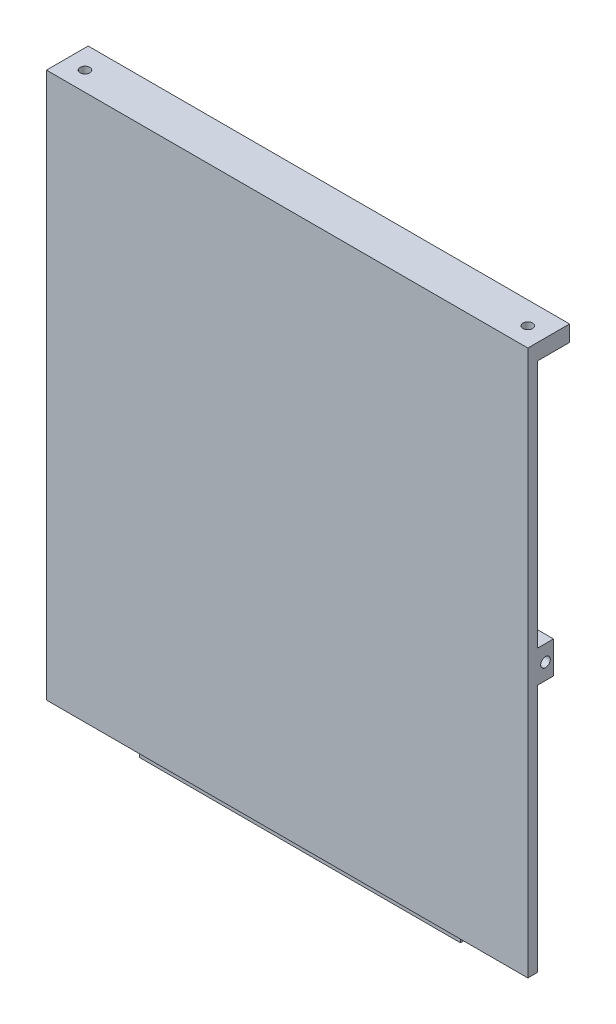
ISO-10303-21;
HEADER;
FILE_DESCRIPTION(('STEP AP214'),'2;1');
FILE_NAME('part.step','',(''),(''),'','','');
FILE_SCHEMA(('AUTOMOTIVE_DESIGN { 1 0 10303 214 1 1 1 1 }'));
ENDSEC;
DATA;
#1=APPLICATION_CONTEXT('core data for automotive mechanical design processes');
#2=APPLICATION_PROTOCOL_DEFINITION('international standard','automotive_design',2000,#1);
#3=PRODUCT_CONTEXT('',#1,'mechanical');
#4=PRODUCT('Part','Part','',(#3));
#5=PRODUCT_RELATED_PRODUCT_CATEGORY('part','',(#4));
#6=PRODUCT_DEFINITION_FORMATION('','',#4);
#7=PRODUCT_DEFINITION_CONTEXT('part definition',#1,'design');
#8=PRODUCT_DEFINITION('design','',#6,#7);
#9=PRODUCT_DEFINITION_SHAPE('','',#8);
#10=(LENGTH_UNIT() NAMED_UNIT(*) SI_UNIT(.MILLI.,.METRE.));
#11=(NAMED_UNIT(*) PLANE_ANGLE_UNIT() SI_UNIT($,.RADIAN.));
#12=(NAMED_UNIT(*) SI_UNIT($,.STERADIAN.) SOLID_ANGLE_UNIT());
#13=UNCERTAINTY_MEASURE_WITH_UNIT(LENGTH_MEASURE(1.E-05),#10,'distance_accuracy_value','');
#14=(GEOMETRIC_REPRESENTATION_CONTEXT(3) GLOBAL_UNCERTAINTY_ASSIGNED_CONTEXT((#13)) GLOBAL_UNIT_ASSIGNED_CONTEXT((#10,
#11,#12)) REPRESENTATION_CONTEXT('',''));
#15=CARTESIAN_POINT('',(0.,0.,0.));
#16=DIRECTION('',(0.,0.,1.));
#17=DIRECTION('',(1.,0.,0.));
#18=AXIS2_PLACEMENT_3D('',#15,#16,#17);
#19=CARTESIAN_POINT('',(0.,-5.,0.));
#20=DIRECTION('',(0.,-1.,0.));
#21=DIRECTION('',(0.,0.,-1.));
#22=AXIS2_PLACEMENT_3D('',#19,#20,#21);
#23=PLANE('',#22);
#24=DIRECTION('',(0.,0.,1.));
#25=VECTOR('',#24,1.);
#26=CARTESIAN_POINT('',(49.9999999999999,-5.,-4.5));
#27=LINE('',#26,#25);
#28=CARTESIAN_POINT('',(49.9999999999999,-5.,-4.5));
#29=VERTEX_POINT('',#28);
#30=CARTESIAN_POINT('',(49.9999999999999,-5.,-2.5));
#31=VERTEX_POINT('',#30);
#32=EDGE_CURVE('E306',#29,#31,#27,.T.);
#33=ORIENTED_EDGE('',*,*,#32,.T.);
#34=DIRECTION('',(1.,0.,0.));
#35=VECTOR('',#34,1.);
#36=CARTESIAN_POINT('',(-50.0000000000001,-5.,-2.5));
#37=LINE('',#36,#35);
#38=CARTESIAN_POINT('',(-50.0000000000001,-5.,-2.5));
#39=VERTEX_POINT('',#38);
#40=EDGE_CURVE('E192',#39,#31,#37,.T.);
#41=ORIENTED_EDGE('',*,*,#40,.F.);
#42=DIRECTION('',(0.,0.,-1.));
#43=VECTOR('',#42,1.);
#44=CARTESIAN_POINT('',(-50.0000000000001,-5.,-4.5));
#45=LINE('',#44,#43);
#46=CARTESIAN_POINT('',(-50.0000000000001,-5.,-4.5));
#47=VERTEX_POINT('',#46);
#48=EDGE_CURVE('E309',#39,#47,#45,.T.);
#49=ORIENTED_EDGE('',*,*,#48,.T.);
#50=DIRECTION('',(1.,0.,0.));
#51=VECTOR('',#50,1.);
#52=CARTESIAN_POINT('',(49.9999999999999,-5.,-4.5));
#53=LINE('',#52,#51);
#54=EDGE_CURVE('E313',#47,#29,#53,.T.);
#55=ORIENTED_EDGE('',*,*,#54,.T.);
#56=EDGE_LOOP('',(#33,#41,#49,#55));
#57=FACE_BOUND('',#56,.T.);
#58=ADVANCED_FACE('F39',(#57),#23,.T.);
#59=CARTESIAN_POINT('',(0.,0.,0.));
#60=DIRECTION('',(0.,1.,0.));
#61=DIRECTION('',(0.,0.,1.));
#62=AXIS2_PLACEMENT_3D('',#59,#60,#61);
#63=PLANE('',#62);
#64=DIRECTION('',(-1.,0.,0.));
#65=VECTOR('',#64,1.);
#66=CARTESIAN_POINT('',(-75.0000000000001,0.,-1.5));
#67=LINE('',#66,#65);
#68=CARTESIAN_POINT('',(-50.0000000000001,0.,-1.5));
#69=VERTEX_POINT('',#68);
#70=CARTESIAN_POINT('',(-75.0000000000001,0.,-1.5));
#71=VERTEX_POINT('',#70);
#72=EDGE_CURVE('E386',#69,#71,#67,.T.);
#73=ORIENTED_EDGE('',*,*,#72,.F.);
#74=DIRECTION('',(0.,0.,1.));
#75=VECTOR('',#74,1.);
#76=CARTESIAN_POINT('',(-50.0000000000001,0.,-2.5));
#77=LINE('',#76,#75);
#78=CARTESIAN_POINT('',(-50.0000000000001,0.,-2.5));
#79=VERTEX_POINT('',#78);
#80=EDGE_CURVE('E186',#79,#69,#77,.T.);
#81=ORIENTED_EDGE('',*,*,#80,.F.);
#82=DIRECTION('',(-1.,0.,0.));
#83=VECTOR('',#82,1.);
#84=CARTESIAN_POINT('',(49.9999999999999,0.,-2.5));
#85=LINE('',#84,#83);
#86=CARTESIAN_POINT('',(49.9999999999999,0.,-2.5));
#87=VERTEX_POINT('',#86);
#88=EDGE_CURVE('E178',#87,#79,#85,.T.);
#89=ORIENTED_EDGE('',*,*,#88,.F.);
#90=DIRECTION('',(0.,0.,1.));
#91=VECTOR('',#90,1.);
#92=CARTESIAN_POINT('',(49.9999999999999,0.,-2.5));
#93=LINE('',#92,#91);
#94=CARTESIAN_POINT('',(49.9999999999999,0.,-1.5));
#95=VERTEX_POINT('',#94);
#96=EDGE_CURVE('E184',#87,#95,#93,.T.);
#97=ORIENTED_EDGE('',*,*,#96,.T.);
#98=CARTESIAN_POINT('',(74.9999999999999,0.,-1.5));
#99=VERTEX_POINT('',#98);
#100=EDGE_CURVE('E387',#99,#95,#67,.T.);
#101=ORIENTED_EDGE('',*,*,#100,.F.);
#102=DIRECTION('',(0.,0.,-1.));
#103=VECTOR('',#102,1.);
#104=CARTESIAN_POINT('',(74.9999999999999,0.,-1.5));
#105=LINE('',#104,#103);
#106=CARTESIAN_POINT('',(74.9999999999999,0.,1.5));
#107=VERTEX_POINT('',#106);
#108=EDGE_CURVE('E371',#107,#99,#105,.T.);
#109=ORIENTED_EDGE('',*,*,#108,.F.);
#110=DIRECTION('',(1.,0.,0.));
#111=VECTOR('',#110,1.);
#112=CARTESIAN_POINT('',(-75.0000000000001,0.,1.5));
#113=LINE('',#112,#111);
#114=CARTESIAN_POINT('',(-75.0000000000001,0.,1.5));
#115=VERTEX_POINT('',#114);
#116=EDGE_CURVE('E376',#115,#107,#113,.T.);
#117=ORIENTED_EDGE('',*,*,#116,.F.);
#118=DIRECTION('',(0.,0.,1.));
#119=VECTOR('',#118,1.);
#120=CARTESIAN_POINT('',(-75.0000000000001,0.,-1.5));
#121=LINE('',#120,#119);
#122=EDGE_CURVE('E390',#71,#115,#121,.T.);
#123=ORIENTED_EDGE('',*,*,#122,.F.);
#124=EDGE_LOOP('',(#73,#81,#89,#97,#101,#109,#117,#123));
#125=FACE_BOUND('',#124,.T.);
#126=ADVANCED_FACE('F181',(#125),#63,.F.);
#127=CARTESIAN_POINT('',(-75.0000000000001,170.,-1.5));
#128=DIRECTION('',(0.,0.,1.));
#129=DIRECTION('',(1.,0.,0.));
#130=AXIS2_PLACEMENT_3D('',#127,#128,#129);
#131=PLANE('',#130);
#132=DIRECTION('',(0.,-1.,0.));
#133=VECTOR('',#132,1.);
#134=CARTESIAN_POINT('',(-75.0000000000001,170.,-1.5));
#135=LINE('',#134,#133);
#136=CARTESIAN_POINT('',(-75.0000000000001,77.5,-1.5));
#137=VERTEX_POINT('',#136);
#138=EDGE_CURVE('E402',#137,#71,#135,.T.);
#139=ORIENTED_EDGE('',*,*,#138,.F.);
#140=DIRECTION('',(1.,0.,0.));
#141=VECTOR('',#140,1.);
#142=CARTESIAN_POINT('',(-75.0000000000001,77.5,-1.5));
#143=LINE('',#142,#141);
#144=CARTESIAN_POINT('',(-70.0000000000001,77.5,-1.5));
#145=VERTEX_POINT('',#144);
#146=EDGE_CURVE('E254',#137,#145,#143,.T.);
#147=ORIENTED_EDGE('',*,*,#146,.T.);
#148=DIRECTION('',(0.,-1.,0.));
#149=VECTOR('',#148,1.);
#150=CARTESIAN_POINT('',(-70.0000000000001,170.,-1.5));
#151=LINE('',#150,#149);
#152=CARTESIAN_POINT('',(-70.0000000000001,87.5,-1.5));
#153=VERTEX_POINT('',#152);
#154=EDGE_CURVE('E244',#153,#145,#151,.T.);
#155=ORIENTED_EDGE('',*,*,#154,.F.);
#156=DIRECTION('',(-1.,0.,0.));
#157=VECTOR('',#156,1.);
#158=CARTESIAN_POINT('',(-75.0000000000001,87.5,-1.5));
#159=LINE('',#158,#157);
#160=CARTESIAN_POINT('',(-75.0000000000001,87.5,-1.5));
#161=VERTEX_POINT('',#160);
#162=EDGE_CURVE('E250',#153,#161,#159,.T.);
#163=ORIENTED_EDGE('',*,*,#162,.T.);
#164=CARTESIAN_POINT('',(-75.0000000000001,165.,-1.5));
#165=VERTEX_POINT('',#164);
#166=EDGE_CURVE('E403',#165,#161,#135,.T.);
#167=ORIENTED_EDGE('',*,*,#166,.F.);
#168=DIRECTION('',(-1.,0.,0.));
#169=VECTOR('',#168,1.);
#170=CARTESIAN_POINT('',(74.9999999999999,165.,-1.5));
#171=LINE('',#170,#169);
#172=CARTESIAN_POINT('',(74.9999999999999,165.,-1.5));
#173=VERTEX_POINT('',#172);
#174=EDGE_CURVE('E344',#173,#165,#171,.T.);
#175=ORIENTED_EDGE('',*,*,#174,.F.);
#176=DIRECTION('',(0.,-1.,0.));
#177=VECTOR('',#176,1.);
#178=CARTESIAN_POINT('',(74.9999999999999,170.,-1.5));
#179=LINE('',#178,#177);
#180=CARTESIAN_POINT('',(74.9999999999999,87.5,-1.5));
#181=VERTEX_POINT('',#180);
#182=EDGE_CURVE('E11',#173,#181,#179,.T.);
#183=ORIENTED_EDGE('',*,*,#182,.T.);
#184=DIRECTION('',(-1.,0.,0.));
#185=VECTOR('',#184,1.);
#186=CARTESIAN_POINT('',(-75.0000000000001,87.5,-1.5));
#187=LINE('',#186,#185);
#188=CARTESIAN_POINT('',(69.9999999999999,87.5,-1.5));
#189=VERTEX_POINT('',#188);
#190=EDGE_CURVE('E294',#181,#189,#187,.T.);
#191=ORIENTED_EDGE('',*,*,#190,.T.);
#192=DIRECTION('',(0.,-1.,0.));
#193=VECTOR('',#192,1.);
#194=CARTESIAN_POINT('',(69.9999999999999,170.,-1.5));
#195=LINE('',#194,#193);
#196=CARTESIAN_POINT('',(69.9999999999999,77.5,-1.5));
#197=VERTEX_POINT('',#196);
#198=EDGE_CURVE('E284',#189,#197,#195,.T.);
#199=ORIENTED_EDGE('',*,*,#198,.T.);
#200=DIRECTION('',(1.,0.,0.));
#201=VECTOR('',#200,1.);
#202=CARTESIAN_POINT('',(-75.0000000000001,77.5,-1.5));
#203=LINE('',#202,#201);
#204=CARTESIAN_POINT('',(74.9999999999999,77.5,-1.5));
#205=VERTEX_POINT('',#204);
#206=EDGE_CURVE('E290',#197,#205,#203,.T.);
#207=ORIENTED_EDGE('',*,*,#206,.T.);
#208=EDGE_CURVE('E49',#205,#99,#179,.T.);
#209=ORIENTED_EDGE('',*,*,#208,.T.);
#210=ORIENTED_EDGE('',*,*,#100,.T.);
#211=DIRECTION('',(0.,-1.,0.));
#212=VECTOR('',#211,1.);
#213=CARTESIAN_POINT('',(49.9999999999999,3.,-1.5));
#214=LINE('',#213,#212);
#215=CARTESIAN_POINT('',(49.9999999999999,3.,-1.5));
#216=VERTEX_POINT('',#215);
#217=EDGE_CURVE('E201',#216,#95,#214,.T.);
#218=ORIENTED_EDGE('',*,*,#217,.F.);
#219=DIRECTION('',(1.,0.,0.));
#220=VECTOR('',#219,1.);
#221=CARTESIAN_POINT('',(49.9999999999999,3.,-1.5));
#222=LINE('',#221,#220);
#223=CARTESIAN_POINT('',(-50.0000000000001,3.,-1.5));
#224=VERTEX_POINT('',#223);
#225=EDGE_CURVE('E332',#224,#216,#222,.T.);
#226=ORIENTED_EDGE('',*,*,#225,.F.);
#227=DIRECTION('',(0.,1.,0.));
#228=VECTOR('',#227,1.);
#229=CARTESIAN_POINT('',(-50.0000000000001,3.,-1.5));
#230=LINE('',#229,#228);
#231=EDGE_CURVE('E317',#69,#224,#230,.T.);
#232=ORIENTED_EDGE('',*,*,#231,.F.);
#233=ORIENTED_EDGE('',*,*,#72,.T.);
#234=EDGE_LOOP('',(#139,#147,#155,#163,#167,#175,#183,#191,#199,#207,#209,#210,#218,#226,#232,#233));
#235=FACE_BOUND('',#234,.T.);
#236=ADVANCED_FACE('F439',(#235),#131,.F.);
#237=CARTESIAN_POINT('',(74.9999999999999,170.,-1.5));
#238=DIRECTION('',(-1.,0.,0.));
#239=DIRECTION('',(0.,0.,1.));
#240=AXIS2_PLACEMENT_3D('',#237,#238,#239);
#241=PLANE('',#240);
#242=CARTESIAN_POINT('',(74.9999999999999,82.5,-4.));
#243=DIRECTION('',(-1.,0.,0.));
#244=DIRECTION('',(0.,0.,1.));
#245=AXIS2_PLACEMENT_3D('',#242,#243,#244);
#246=CIRCLE('',#245,1.5);
#247=CARTESIAN_POINT('',(74.9999999999999,82.5,-2.5));
#248=VERTEX_POINT('',#247);
#249=EDGE_CURVE('E210',#248,#248,#246,.T.);
#250=ORIENTED_EDGE('',*,*,#249,.T.);
#251=EDGE_LOOP('',(#250));
#252=FACE_BOUND('',#251,.T.);
#253=ORIENTED_EDGE('',*,*,#208,.F.);
#254=DIRECTION('',(0.,0.,-1.));
#255=VECTOR('',#254,1.);
#256=CARTESIAN_POINT('',(74.9999999999999,77.5,1.5));
#257=LINE('',#256,#255);
#258=CARTESIAN_POINT('',(74.9999999999999,77.5,-6.5));
#259=VERTEX_POINT('',#258);
#260=EDGE_CURVE('E258',#205,#259,#257,.T.);
#261=ORIENTED_EDGE('',*,*,#260,.T.);
#262=DIRECTION('',(0.,1.,0.));
#263=VECTOR('',#262,1.);
#264=CARTESIAN_POINT('',(74.9999999999999,77.5,-6.5));
#265=LINE('',#264,#263);
#266=CARTESIAN_POINT('',(74.9999999999999,87.5,-6.5));
#267=VERTEX_POINT('',#266);
#268=EDGE_CURVE('E274',#259,#267,#265,.T.);
#269=ORIENTED_EDGE('',*,*,#268,.T.);
#270=DIRECTION('',(0.,0.,1.));
#271=VECTOR('',#270,1.);
#272=CARTESIAN_POINT('',(74.9999999999999,87.5,1.5));
#273=LINE('',#272,#271);
#274=EDGE_CURVE('E263',#267,#181,#273,.T.);
#275=ORIENTED_EDGE('',*,*,#274,.T.);
#276=ORIENTED_EDGE('',*,*,#182,.F.);
#277=DIRECTION('',(0.,0.,1.));
#278=VECTOR('',#277,1.);
#279=CARTESIAN_POINT('',(74.9999999999999,165.,-11.5));
#280=LINE('',#279,#278);
#281=CARTESIAN_POINT('',(74.9999999999999,165.,-11.5));
#282=VERTEX_POINT('',#281);
#283=EDGE_CURVE('E367',#282,#173,#280,.T.);
#284=ORIENTED_EDGE('',*,*,#283,.F.);
#285=DIRECTION('',(0.,-1.,0.));
#286=VECTOR('',#285,1.);
#287=CARTESIAN_POINT('',(74.9999999999999,170.,-11.5));
#288=LINE('',#287,#286);
#289=CARTESIAN_POINT('',(74.9999999999999,170.,-11.5));
#290=VERTEX_POINT('',#289);
#291=EDGE_CURVE('E345',#290,#282,#288,.T.);
#292=ORIENTED_EDGE('',*,*,#291,.F.);
#293=DIRECTION('',(0.,0.,-1.));
#294=VECTOR('',#293,1.);
#295=CARTESIAN_POINT('',(74.9999999999999,170.,-1.5));
#296=LINE('',#295,#294);
#297=CARTESIAN_POINT('',(74.9999999999999,170.,1.5));
#298=VERTEX_POINT('',#297);
#299=EDGE_CURVE('E372',#298,#290,#296,.T.);
#300=ORIENTED_EDGE('',*,*,#299,.F.);
#301=DIRECTION('',(0.,-1.,0.));
#302=VECTOR('',#301,1.);
#303=CARTESIAN_POINT('',(74.9999999999999,170.,1.5));
#304=LINE('',#303,#302);
#305=EDGE_CURVE('E382',#298,#107,#304,.T.);
#306=ORIENTED_EDGE('',*,*,#305,.T.);
#307=ORIENTED_EDGE('',*,*,#108,.T.);
#308=EDGE_LOOP('',(#253,#261,#269,#275,#276,#284,#292,#300,#306,#307));
#309=FACE_BOUND('',#308,.T.);
#310=ADVANCED_FACE('F41',(#252,#309),#241,.F.);
#311=CARTESIAN_POINT('',(-75.0000000000001,170.,-1.5));
#312=DIRECTION('',(1.,0.,0.));
#313=DIRECTION('',(0.,0.,-1.));
#314=AXIS2_PLACEMENT_3D('',#311,#312,#313);
#315=PLANE('',#314);
#316=CARTESIAN_POINT('',(-75.0000000000001,82.5,-4.));
#317=DIRECTION('',(-1.,0.,0.));
#318=DIRECTION('',(0.,0.,1.));
#319=AXIS2_PLACEMENT_3D('',#316,#317,#318);
#320=CIRCLE('',#319,1.5);
#321=CARTESIAN_POINT('',(-75.0000000000001,82.5,-2.5));
#322=VERTEX_POINT('',#321);
#323=EDGE_CURVE('E206',#322,#322,#320,.T.);
#324=ORIENTED_EDGE('',*,*,#323,.F.);
#325=EDGE_LOOP('',(#324));
#326=FACE_BOUND('',#325,.T.);
#327=ORIENTED_EDGE('',*,*,#166,.T.);
#328=DIRECTION('',(0.,0.,-1.));
#329=VECTOR('',#328,1.);
#330=CARTESIAN_POINT('',(-75.0000000000001,87.5,1.5));
#331=LINE('',#330,#329);
#332=CARTESIAN_POINT('',(-75.0000000000001,87.5,-6.5));
#333=VERTEX_POINT('',#332);
#334=EDGE_CURVE('E221',#161,#333,#331,.T.);
#335=ORIENTED_EDGE('',*,*,#334,.T.);
#336=DIRECTION('',(0.,-1.,0.));
#337=VECTOR('',#336,1.);
#338=CARTESIAN_POINT('',(-75.0000000000001,77.5,-6.5));
#339=LINE('',#338,#337);
#340=CARTESIAN_POINT('',(-75.0000000000001,77.5,-6.5));
#341=VERTEX_POINT('',#340);
#342=EDGE_CURVE('E236',#333,#341,#339,.T.);
#343=ORIENTED_EDGE('',*,*,#342,.T.);
#344=DIRECTION('',(0.,0.,1.));
#345=VECTOR('',#344,1.);
#346=CARTESIAN_POINT('',(-75.0000000000001,77.5,1.5));
#347=LINE('',#346,#345);
#348=EDGE_CURVE('E65',#341,#137,#347,.T.);
#349=ORIENTED_EDGE('',*,*,#348,.T.);
#350=ORIENTED_EDGE('',*,*,#138,.T.);
#351=ORIENTED_EDGE('',*,*,#122,.T.);
#352=DIRECTION('',(0.,-1.,0.));
#353=VECTOR('',#352,1.);
#354=CARTESIAN_POINT('',(-75.0000000000001,170.,1.5));
#355=LINE('',#354,#353);
#356=CARTESIAN_POINT('',(-75.0000000000001,170.,1.5));
#357=VERTEX_POINT('',#356);
#358=EDGE_CURVE('E399',#357,#115,#355,.T.);
#359=ORIENTED_EDGE('',*,*,#358,.F.);
#360=DIRECTION('',(0.,0.,1.));
#361=VECTOR('',#360,1.);
#362=CARTESIAN_POINT('',(-75.0000000000001,170.,-1.5));
#363=LINE('',#362,#361);
#364=CARTESIAN_POINT('',(-75.0000000000001,170.,-11.5));
#365=VERTEX_POINT('',#364);
#366=EDGE_CURVE('E375',#365,#357,#363,.T.);
#367=ORIENTED_EDGE('',*,*,#366,.F.);
#368=DIRECTION('',(0.,1.,0.));
#369=VECTOR('',#368,1.);
#370=CARTESIAN_POINT('',(-75.0000000000001,170.,-11.5));
#371=LINE('',#370,#369);
#372=CARTESIAN_POINT('',(-75.0000000000001,165.,-11.5));
#373=VERTEX_POINT('',#372);
#374=EDGE_CURVE('E352',#373,#365,#371,.T.);
#375=ORIENTED_EDGE('',*,*,#374,.F.);
#376=DIRECTION('',(0.,0.,1.));
#377=VECTOR('',#376,1.);
#378=CARTESIAN_POINT('',(-75.0000000000001,165.,-11.5));
#379=LINE('',#378,#377);
#380=EDGE_CURVE('E360',#373,#165,#379,.T.);
#381=ORIENTED_EDGE('',*,*,#380,.T.);
#382=EDGE_LOOP('',(#327,#335,#343,#349,#350,#351,#359,#367,#375,#381));
#383=FACE_BOUND('',#382,.T.);
#384=ADVANCED_FACE('F468',(#326,#383),#315,.F.);
#385=CARTESIAN_POINT('',(-75.0000000000001,170.,1.5));
#386=DIRECTION('',(0.,0.,-1.));
#387=DIRECTION('',(-1.,0.,0.));
#388=AXIS2_PLACEMENT_3D('',#385,#386,#387);
#389=PLANE('',#388);
#390=ORIENTED_EDGE('',*,*,#358,.T.);
#391=ORIENTED_EDGE('',*,*,#116,.T.);
#392=ORIENTED_EDGE('',*,*,#305,.F.);
#393=DIRECTION('',(1.,0.,0.));
#394=VECTOR('',#393,1.);
#395=CARTESIAN_POINT('',(-75.0000000000001,170.,1.5));
#396=LINE('',#395,#394);
#397=EDGE_CURVE('E379',#357,#298,#396,.T.);
#398=ORIENTED_EDGE('',*,*,#397,.F.);
#399=EDGE_LOOP('',(#390,#391,#392,#398));
#400=FACE_BOUND('',#399,.T.);
#401=ADVANCED_FACE('F463',(#400),#389,.F.);
#402=CARTESIAN_POINT('',(0.,170.,0.));
#403=DIRECTION('',(0.,1.,0.));
#404=DIRECTION('',(0.,0.,1.));
#405=AXIS2_PLACEMENT_3D('',#402,#403,#404);
#406=PLANE('',#405);
#407=CARTESIAN_POINT('',(68.9999999999999,170.,-4.5));
#408=DIRECTION('',(0.,1.,0.));
#409=DIRECTION('',(0.,0.,1.));
#410=AXIS2_PLACEMENT_3D('',#407,#408,#409);
#411=CIRCLE('',#410,1.5);
#412=CARTESIAN_POINT('',(68.9999999999999,170.,-3.));
#413=VERTEX_POINT('',#412);
#414=EDGE_CURVE('E298',#413,#413,#411,.T.);
#415=ORIENTED_EDGE('',*,*,#414,.F.);
#416=EDGE_LOOP('',(#415));
#417=FACE_BOUND('',#416,.T.);
#418=CARTESIAN_POINT('',(-69.,170.,-4.49999999999861));
#419=DIRECTION('',(0.,1.,0.));
#420=DIRECTION('',(0.,0.,-1.));
#421=AXIS2_PLACEMENT_3D('',#418,#419,#420);
#422=CIRCLE('',#421,1.49999999999999);
#423=CARTESIAN_POINT('',(-69.,170.,-5.9999999999986));
#424=VERTEX_POINT('',#423);
#425=EDGE_CURVE('E297',#424,#424,#422,.T.);
#426=ORIENTED_EDGE('',*,*,#425,.F.);
#427=EDGE_LOOP('',(#426));
#428=FACE_BOUND('',#427,.T.);
#429=ORIENTED_EDGE('',*,*,#299,.T.);
#430=DIRECTION('',(1.,0.,0.));
#431=VECTOR('',#430,1.);
#432=CARTESIAN_POINT('',(74.9999999999999,170.,-11.5));
#433=LINE('',#432,#431);
#434=EDGE_CURVE('E356',#365,#290,#433,.T.);
#435=ORIENTED_EDGE('',*,*,#434,.F.);
#436=ORIENTED_EDGE('',*,*,#366,.T.);
#437=ORIENTED_EDGE('',*,*,#397,.T.);
#438=EDGE_LOOP('',(#429,#435,#436,#437));
#439=FACE_BOUND('',#438,.T.);
#440=ADVANCED_FACE('F461',(#417,#428,#439),#406,.T.);
#441=CARTESIAN_POINT('',(74.9999999999999,165.,-11.5));
#442=DIRECTION('',(0.,1.,0.));
#443=DIRECTION('',(0.,0.,1.));
#444=AXIS2_PLACEMENT_3D('',#441,#442,#443);
#445=PLANE('',#444);
#446=CARTESIAN_POINT('',(68.9999999999999,165.,-4.5));
#447=DIRECTION('',(0.,1.,0.));
#448=DIRECTION('',(0.,0.,1.));
#449=AXIS2_PLACEMENT_3D('',#446,#447,#448);
#450=CIRCLE('',#449,1.5);
#451=CARTESIAN_POINT('',(68.9999999999999,165.,-3.));
#452=VERTEX_POINT('',#451);
#453=EDGE_CURVE('E310',#452,#452,#450,.T.);
#454=ORIENTED_EDGE('',*,*,#453,.T.);
#455=EDGE_LOOP('',(#454));
#456=FACE_BOUND('',#455,.T.);
#457=CARTESIAN_POINT('',(-69.,165.,-4.49999999999861));
#458=DIRECTION('',(0.,1.,0.));
#459=DIRECTION('',(0.,0.,1.));
#460=AXIS2_PLACEMENT_3D('',#457,#458,#459);
#461=CIRCLE('',#460,1.49999999999999);
#462=CARTESIAN_POINT('',(-69.,165.,-2.99999999999863));
#463=VERTEX_POINT('',#462);
#464=EDGE_CURVE('E302',#463,#463,#461,.T.);
#465=ORIENTED_EDGE('',*,*,#464,.T.);
#466=EDGE_LOOP('',(#465));
#467=FACE_BOUND('',#466,.T.);
#468=ORIENTED_EDGE('',*,*,#174,.T.);
#469=ORIENTED_EDGE('',*,*,#380,.F.);
#470=DIRECTION('',(-1.,0.,0.));
#471=VECTOR('',#470,1.);
#472=CARTESIAN_POINT('',(74.9999999999999,165.,-11.5));
#473=LINE('',#472,#471);
#474=EDGE_CURVE('E349',#282,#373,#473,.T.);
#475=ORIENTED_EDGE('',*,*,#474,.F.);
#476=ORIENTED_EDGE('',*,*,#283,.T.);
#477=EDGE_LOOP('',(#468,#469,#475,#476));
#478=FACE_BOUND('',#477,.T.);
#479=ADVANCED_FACE('F413',(#456,#467,#478),#445,.F.);
#480=CARTESIAN_POINT('',(0.,0.,-11.5));
#481=DIRECTION('',(0.,0.,-1.));
#482=DIRECTION('',(-1.,0.,0.));
#483=AXIS2_PLACEMENT_3D('',#480,#481,#482);
#484=PLANE('',#483);
#485=ORIENTED_EDGE('',*,*,#291,.T.);
#486=ORIENTED_EDGE('',*,*,#474,.T.);
#487=ORIENTED_EDGE('',*,*,#374,.T.);
#488=ORIENTED_EDGE('',*,*,#434,.T.);
#489=EDGE_LOOP('',(#485,#486,#487,#488));
#490=FACE_BOUND('',#489,.T.);
#491=ADVANCED_FACE('F454',(#490),#484,.T.);
#492=CARTESIAN_POINT('',(-50.0000000000001,3.,-4.5));
#493=DIRECTION('',(1.,0.,0.));
#494=DIRECTION('',(0.,1.,0.));
#495=AXIS2_PLACEMENT_3D('',#492,#493,#494);
#496=PLANE('',#495);
#497=DIRECTION('',(0.,-1.,0.));
#498=VECTOR('',#497,1.);
#499=CARTESIAN_POINT('',(-50.0000000000001,0.,-2.5));
#500=LINE('',#499,#498);
#501=EDGE_CURVE('E57',#79,#39,#500,.T.);
#502=ORIENTED_EDGE('',*,*,#501,.F.);
#503=ORIENTED_EDGE('',*,*,#80,.T.);
#504=ORIENTED_EDGE('',*,*,#231,.T.);
#505=DIRECTION('',(0.,0.,1.));
#506=VECTOR('',#505,1.);
#507=CARTESIAN_POINT('',(-50.0000000000001,3.,-4.5));
#508=LINE('',#507,#506);
#509=CARTESIAN_POINT('',(-50.0000000000001,3.,-4.5));
#510=VERTEX_POINT('',#509);
#511=EDGE_CURVE('E340',#510,#224,#508,.T.);
#512=ORIENTED_EDGE('',*,*,#511,.F.);
#513=DIRECTION('',(0.,1.,0.));
#514=VECTOR('',#513,1.);
#515=CARTESIAN_POINT('',(-50.0000000000001,3.,-4.5));
#516=LINE('',#515,#514);
#517=EDGE_CURVE('E318',#47,#510,#516,.T.);
#518=ORIENTED_EDGE('',*,*,#517,.F.);
#519=ORIENTED_EDGE('',*,*,#48,.F.);
#520=EDGE_LOOP('',(#502,#503,#504,#512,#518,#519));
#521=FACE_BOUND('',#520,.T.);
#522=ADVANCED_FACE('F450',(#521),#496,.F.);
#523=CARTESIAN_POINT('',(49.9999999999999,3.,-4.5));
#524=DIRECTION('',(0.,-1.,0.));
#525=DIRECTION('',(0.,0.,-1.));
#526=AXIS2_PLACEMENT_3D('',#523,#524,#525);
#527=PLANE('',#526);
#528=ORIENTED_EDGE('',*,*,#225,.T.);
#529=DIRECTION('',(0.,0.,1.));
#530=VECTOR('',#529,1.);
#531=CARTESIAN_POINT('',(49.9999999999999,3.,-4.5));
#532=LINE('',#531,#530);
#533=CARTESIAN_POINT('',(49.9999999999999,3.,-4.5));
#534=VERTEX_POINT('',#533);
#535=EDGE_CURVE('E328',#534,#216,#532,.T.);
#536=ORIENTED_EDGE('',*,*,#535,.F.);
#537=DIRECTION('',(1.,0.,0.));
#538=VECTOR('',#537,1.);
#539=CARTESIAN_POINT('',(49.9999999999999,3.,-4.5));
#540=LINE('',#539,#538);
#541=EDGE_CURVE('E322',#510,#534,#540,.T.);
#542=ORIENTED_EDGE('',*,*,#541,.F.);
#543=ORIENTED_EDGE('',*,*,#511,.T.);
#544=EDGE_LOOP('',(#528,#536,#542,#543));
#545=FACE_BOUND('',#544,.T.);
#546=ADVANCED_FACE('F447',(#545),#527,.F.);
#547=CARTESIAN_POINT('',(49.9999999999999,3.,-4.5));
#548=DIRECTION('',(-1.,0.,0.));
#549=DIRECTION('',(0.,0.,1.));
#550=AXIS2_PLACEMENT_3D('',#547,#548,#549);
#551=PLANE('',#550);
#552=ORIENTED_EDGE('',*,*,#217,.T.);
#553=ORIENTED_EDGE('',*,*,#96,.F.);
#554=DIRECTION('',(0.,1.,0.));
#555=VECTOR('',#554,1.);
#556=CARTESIAN_POINT('',(49.9999999999999,-5.,-2.5));
#557=LINE('',#556,#555);
#558=EDGE_CURVE('E188',#31,#87,#557,.T.);
#559=ORIENTED_EDGE('',*,*,#558,.F.);
#560=ORIENTED_EDGE('',*,*,#32,.F.);
#561=DIRECTION('',(0.,-1.,0.));
#562=VECTOR('',#561,1.);
#563=CARTESIAN_POINT('',(49.9999999999999,3.,-4.5));
#564=LINE('',#563,#562);
#565=EDGE_CURVE('E325',#534,#29,#564,.T.);
#566=ORIENTED_EDGE('',*,*,#565,.F.);
#567=ORIENTED_EDGE('',*,*,#535,.T.);
#568=EDGE_LOOP('',(#552,#553,#559,#560,#566,#567));
#569=FACE_BOUND('',#568,.T.);
#570=ADVANCED_FACE('F199',(#569),#551,.F.);
#571=CARTESIAN_POINT('',(0.,0.,-4.5));
#572=DIRECTION('',(0.,0.,-1.));
#573=DIRECTION('',(-1.,0.,0.));
#574=AXIS2_PLACEMENT_3D('',#571,#572,#573);
#575=PLANE('',#574);
#576=ORIENTED_EDGE('',*,*,#517,.T.);
#577=ORIENTED_EDGE('',*,*,#541,.T.);
#578=ORIENTED_EDGE('',*,*,#565,.T.);
#579=ORIENTED_EDGE('',*,*,#54,.F.);
#580=EDGE_LOOP('',(#576,#577,#578,#579));
#581=FACE_BOUND('',#580,.T.);
#582=ADVANCED_FACE('F429',(#581),#575,.T.);
#583=CARTESIAN_POINT('',(-69.,-5.,-4.49999999999861));
#584=DIRECTION('',(0.,1.,0.));
#585=DIRECTION('',(0.,0.,1.));
#586=AXIS2_PLACEMENT_3D('',#583,#584,#585);
#587=CYLINDRICAL_SURFACE('',#586,1.49999999999999);
#588=ORIENTED_EDGE('',*,*,#425,.T.);
#589=EDGE_LOOP('',(#588));
#590=FACE_BOUND('',#589,.T.);
#591=ORIENTED_EDGE('',*,*,#464,.F.);
#592=EDGE_LOOP('',(#591));
#593=FACE_BOUND('',#592,.T.);
#594=ADVANCED_FACE('F419',(#590,#593),#587,.F.);
#595=CARTESIAN_POINT('',(68.9999999999999,-5.,-4.5));
#596=DIRECTION('',(0.,1.,0.));
#597=DIRECTION('',(0.,0.,1.));
#598=AXIS2_PLACEMENT_3D('',#595,#596,#597);
#599=CYLINDRICAL_SURFACE('',#598,1.5);
#600=ORIENTED_EDGE('',*,*,#414,.T.);
#601=EDGE_LOOP('',(#600));
#602=FACE_BOUND('',#601,.T.);
#603=ORIENTED_EDGE('',*,*,#453,.F.);
#604=EDGE_LOOP('',(#603));
#605=FACE_BOUND('',#604,.T.);
#606=ADVANCED_FACE('F416',(#602,#605),#599,.F.);
#607=CARTESIAN_POINT('',(69.9999999999999,87.5,1.5));
#608=DIRECTION('',(0.,1.,0.));
#609=DIRECTION('',(0.,0.,1.));
#610=AXIS2_PLACEMENT_3D('',#607,#608,#609);
#611=PLANE('',#610);
#612=ORIENTED_EDGE('',*,*,#190,.F.);
#613=ORIENTED_EDGE('',*,*,#274,.F.);
#614=DIRECTION('',(1.,0.,0.));
#615=VECTOR('',#614,1.);
#616=CARTESIAN_POINT('',(69.9999999999999,87.5,-6.5));
#617=LINE('',#616,#615);
#618=CARTESIAN_POINT('',(69.9999999999999,87.5,-6.5));
#619=VERTEX_POINT('',#618);
#620=EDGE_CURVE('E281',#619,#267,#617,.T.);
#621=ORIENTED_EDGE('',*,*,#620,.F.);
#622=DIRECTION('',(0.,0.,1.));
#623=VECTOR('',#622,1.);
#624=CARTESIAN_POINT('',(69.9999999999999,87.5,1.5));
#625=LINE('',#624,#623);
#626=EDGE_CURVE('E267',#619,#189,#625,.T.);
#627=ORIENTED_EDGE('',*,*,#626,.T.);
#628=EDGE_LOOP('',(#612,#613,#621,#627));
#629=FACE_BOUND('',#628,.T.);
#630=ADVANCED_FACE('F418',(#629),#611,.T.);
#631=CARTESIAN_POINT('',(69.9999999999999,77.5,1.5));
#632=DIRECTION('',(0.,-1.,0.));
#633=DIRECTION('',(0.,0.,-1.));
#634=AXIS2_PLACEMENT_3D('',#631,#632,#633);
#635=PLANE('',#634);
#636=ORIENTED_EDGE('',*,*,#206,.F.);
#637=DIRECTION('',(0.,0.,-1.));
#638=VECTOR('',#637,1.);
#639=CARTESIAN_POINT('',(69.9999999999999,77.5,1.5));
#640=LINE('',#639,#638);
#641=CARTESIAN_POINT('',(69.9999999999999,77.5,-6.5));
#642=VERTEX_POINT('',#641);
#643=EDGE_CURVE('E259',#197,#642,#640,.T.);
#644=ORIENTED_EDGE('',*,*,#643,.T.);
#645=DIRECTION('',(1.,0.,0.));
#646=VECTOR('',#645,1.);
#647=CARTESIAN_POINT('',(69.9999999999999,77.5,-6.5));
#648=LINE('',#647,#646);
#649=EDGE_CURVE('E271',#642,#259,#648,.T.);
#650=ORIENTED_EDGE('',*,*,#649,.T.);
#651=ORIENTED_EDGE('',*,*,#260,.F.);
#652=EDGE_LOOP('',(#636,#644,#650,#651));
#653=FACE_BOUND('',#652,.T.);
#654=ADVANCED_FACE('F426',(#653),#635,.T.);
#655=CARTESIAN_POINT('',(69.9999999999999,0.,0.));
#656=DIRECTION('',(-1.,0.,0.));
#657=DIRECTION('',(0.,0.,1.));
#658=AXIS2_PLACEMENT_3D('',#655,#656,#657);
#659=PLANE('',#658);
#660=CARTESIAN_POINT('',(69.9999999999999,82.5,-4.));
#661=DIRECTION('',(-1.,0.,0.));
#662=DIRECTION('',(0.,0.,1.));
#663=AXIS2_PLACEMENT_3D('',#660,#661,#662);
#664=CIRCLE('',#663,1.5);
#665=CARTESIAN_POINT('',(69.9999999999999,82.5,-2.5));
#666=VERTEX_POINT('',#665);
#667=EDGE_CURVE('E217',#666,#666,#664,.T.);
#668=ORIENTED_EDGE('',*,*,#667,.F.);
#669=EDGE_LOOP('',(#668));
#670=FACE_BOUND('',#669,.T.);
#671=ORIENTED_EDGE('',*,*,#198,.F.);
#672=ORIENTED_EDGE('',*,*,#626,.F.);
#673=DIRECTION('',(0.,1.,0.));
#674=VECTOR('',#673,1.);
#675=CARTESIAN_POINT('',(69.9999999999999,77.5,-6.5));
#676=LINE('',#675,#674);
#677=EDGE_CURVE('E262',#642,#619,#676,.T.);
#678=ORIENTED_EDGE('',*,*,#677,.F.);
#679=ORIENTED_EDGE('',*,*,#643,.F.);
#680=EDGE_LOOP('',(#671,#672,#678,#679));
#681=FACE_BOUND('',#680,.T.);
#682=ADVANCED_FACE('F524',(#670,#681),#659,.T.);
#683=CARTESIAN_POINT('',(69.9999999999999,77.5,-6.5));
#684=DIRECTION('',(0.,0.,-1.));
#685=DIRECTION('',(-1.,0.,0.));
#686=AXIS2_PLACEMENT_3D('',#683,#684,#685);
#687=PLANE('',#686);
#688=ORIENTED_EDGE('',*,*,#268,.F.);
#689=ORIENTED_EDGE('',*,*,#649,.F.);
#690=ORIENTED_EDGE('',*,*,#677,.T.);
#691=ORIENTED_EDGE('',*,*,#620,.T.);
#692=EDGE_LOOP('',(#688,#689,#690,#691));
#693=FACE_BOUND('',#692,.T.);
#694=ADVANCED_FACE('F517',(#693),#687,.T.);
#695=CARTESIAN_POINT('',(-70.0000000000001,77.5,1.5));
#696=DIRECTION('',(0.,-1.,0.));
#697=DIRECTION('',(0.,0.,-1.));
#698=AXIS2_PLACEMENT_3D('',#695,#696,#697);
#699=PLANE('',#698);
#700=ORIENTED_EDGE('',*,*,#146,.F.);
#701=ORIENTED_EDGE('',*,*,#348,.F.);
#702=DIRECTION('',(-1.,0.,0.));
#703=VECTOR('',#702,1.);
#704=CARTESIAN_POINT('',(-70.0000000000001,77.5,-6.5));
#705=LINE('',#704,#703);
#706=CARTESIAN_POINT('',(-70.0000000000001,77.5,-6.5));
#707=VERTEX_POINT('',#706);
#708=EDGE_CURVE('E241',#707,#341,#705,.T.);
#709=ORIENTED_EDGE('',*,*,#708,.F.);
#710=DIRECTION('',(0.,0.,1.));
#711=VECTOR('',#710,1.);
#712=CARTESIAN_POINT('',(-70.0000000000001,77.5,1.5));
#713=LINE('',#712,#711);
#714=EDGE_CURVE('E229',#707,#145,#713,.T.);
#715=ORIENTED_EDGE('',*,*,#714,.T.);
#716=EDGE_LOOP('',(#700,#701,#709,#715));
#717=FACE_BOUND('',#716,.T.);
#718=ADVANCED_FACE('F515',(#717),#699,.T.);
#719=CARTESIAN_POINT('',(-70.0000000000001,87.5,1.5));
#720=DIRECTION('',(0.,1.,0.));
#721=DIRECTION('',(0.,0.,1.));
#722=AXIS2_PLACEMENT_3D('',#719,#720,#721);
#723=PLANE('',#722);
#724=ORIENTED_EDGE('',*,*,#162,.F.);
#725=DIRECTION('',(0.,0.,-1.));
#726=VECTOR('',#725,1.);
#727=CARTESIAN_POINT('',(-70.0000000000001,87.5,1.5));
#728=LINE('',#727,#726);
#729=CARTESIAN_POINT('',(-70.0000000000001,87.5,-6.5));
#730=VERTEX_POINT('',#729);
#731=EDGE_CURVE('E222',#153,#730,#728,.T.);
#732=ORIENTED_EDGE('',*,*,#731,.T.);
#733=DIRECTION('',(-1.,0.,0.));
#734=VECTOR('',#733,1.);
#735=CARTESIAN_POINT('',(-70.0000000000001,87.5,-6.5));
#736=LINE('',#735,#734);
#737=EDGE_CURVE('E233',#730,#333,#736,.T.);
#738=ORIENTED_EDGE('',*,*,#737,.T.);
#739=ORIENTED_EDGE('',*,*,#334,.F.);
#740=EDGE_LOOP('',(#724,#732,#738,#739));
#741=FACE_BOUND('',#740,.T.);
#742=ADVANCED_FACE('F505',(#741),#723,.T.);
#743=CARTESIAN_POINT('',(-70.0000000000001,0.,0.));
#744=DIRECTION('',(-1.,0.,0.));
#745=DIRECTION('',(0.,0.,1.));
#746=AXIS2_PLACEMENT_3D('',#743,#744,#745);
#747=PLANE('',#746);
#748=CARTESIAN_POINT('',(-70.0000000000001,82.5,-4.));
#749=DIRECTION('',(-1.,0.,0.));
#750=DIRECTION('',(0.,0.,1.));
#751=AXIS2_PLACEMENT_3D('',#748,#749,#750);
#752=CIRCLE('',#751,1.5);
#753=CARTESIAN_POINT('',(-70.0000000000001,82.5,-2.5));
#754=VERTEX_POINT('',#753);
#755=EDGE_CURVE('E43',#754,#754,#752,.T.);
#756=ORIENTED_EDGE('',*,*,#755,.T.);
#757=EDGE_LOOP('',(#756));
#758=FACE_BOUND('',#757,.T.);
#759=ORIENTED_EDGE('',*,*,#731,.F.);
#760=ORIENTED_EDGE('',*,*,#154,.T.);
#761=ORIENTED_EDGE('',*,*,#714,.F.);
#762=DIRECTION('',(0.,-1.,0.));
#763=VECTOR('',#762,1.);
#764=CARTESIAN_POINT('',(-70.0000000000001,77.5,-6.5));
#765=LINE('',#764,#763);
#766=EDGE_CURVE('E225',#730,#707,#765,.T.);
#767=ORIENTED_EDGE('',*,*,#766,.F.);
#768=EDGE_LOOP('',(#759,#760,#761,#767));
#769=FACE_BOUND('',#768,.T.);
#770=ADVANCED_FACE('F509',(#758,#769),#747,.F.);
#771=CARTESIAN_POINT('',(-70.0000000000001,77.5,-6.5));
#772=DIRECTION('',(0.,0.,-1.));
#773=DIRECTION('',(-1.,0.,0.));
#774=AXIS2_PLACEMENT_3D('',#771,#772,#773);
#775=PLANE('',#774);
#776=ORIENTED_EDGE('',*,*,#342,.F.);
#777=ORIENTED_EDGE('',*,*,#737,.F.);
#778=ORIENTED_EDGE('',*,*,#766,.T.);
#779=ORIENTED_EDGE('',*,*,#708,.T.);
#780=EDGE_LOOP('',(#776,#777,#778,#779));
#781=FACE_BOUND('',#780,.T.);
#782=ADVANCED_FACE('F513',(#781),#775,.T.);
#783=CARTESIAN_POINT('',(74.9999999999999,82.5,-4.));
#784=DIRECTION('',(-1.,0.,0.));
#785=DIRECTION('',(0.,0.,1.));
#786=AXIS2_PLACEMENT_3D('',#783,#784,#785);
#787=CYLINDRICAL_SURFACE('',#786,1.5);
#788=ORIENTED_EDGE('',*,*,#323,.T.);
#789=EDGE_LOOP('',(#788));
#790=FACE_BOUND('',#789,.T.);
#791=ORIENTED_EDGE('',*,*,#755,.F.);
#792=EDGE_LOOP('',(#791));
#793=FACE_BOUND('',#792,.T.);
#794=ADVANCED_FACE('F531',(#790,#793),#787,.F.);
#795=ORIENTED_EDGE('',*,*,#667,.T.);
#796=EDGE_LOOP('',(#795));
#797=FACE_BOUND('',#796,.T.);
#798=ORIENTED_EDGE('',*,*,#249,.F.);
#799=EDGE_LOOP('',(#798));
#800=FACE_BOUND('',#799,.T.);
#801=ADVANCED_FACE('F683',(#797,#800),#787,.F.);
#802=CARTESIAN_POINT('',(0.,0.,-2.5));
#803=DIRECTION('',(0.,0.,1.));
#804=DIRECTION('',(1.,0.,0.));
#805=AXIS2_PLACEMENT_3D('',#802,#803,#804);
#806=PLANE('',#805);
#807=ORIENTED_EDGE('',*,*,#558,.T.);
#808=ORIENTED_EDGE('',*,*,#88,.T.);
#809=ORIENTED_EDGE('',*,*,#501,.T.);
#810=ORIENTED_EDGE('',*,*,#40,.T.);
#811=EDGE_LOOP('',(#807,#808,#809,#810));
#812=FACE_BOUND('',#811,.T.);
#813=ADVANCED_FACE('F191',(#812),#806,.T.);
#814=CLOSED_SHELL('',(#58,#126,#236,#310,#384,#401,#440,#479,#491,#522,#546,#570,#582,#594,#606,
#630,#654,#682,#694,#718,#742,#770,#782,#794,#801,#813));
#815=MANIFOLD_SOLID_BREP('B2',#814);
#816=ADVANCED_BREP_SHAPE_REPRESENTATION('',(#18,#815),#14);
#817=SHAPE_DEFINITION_REPRESENTATION(#9,#816);
ENDSEC;
END-ISO-10303-21;
